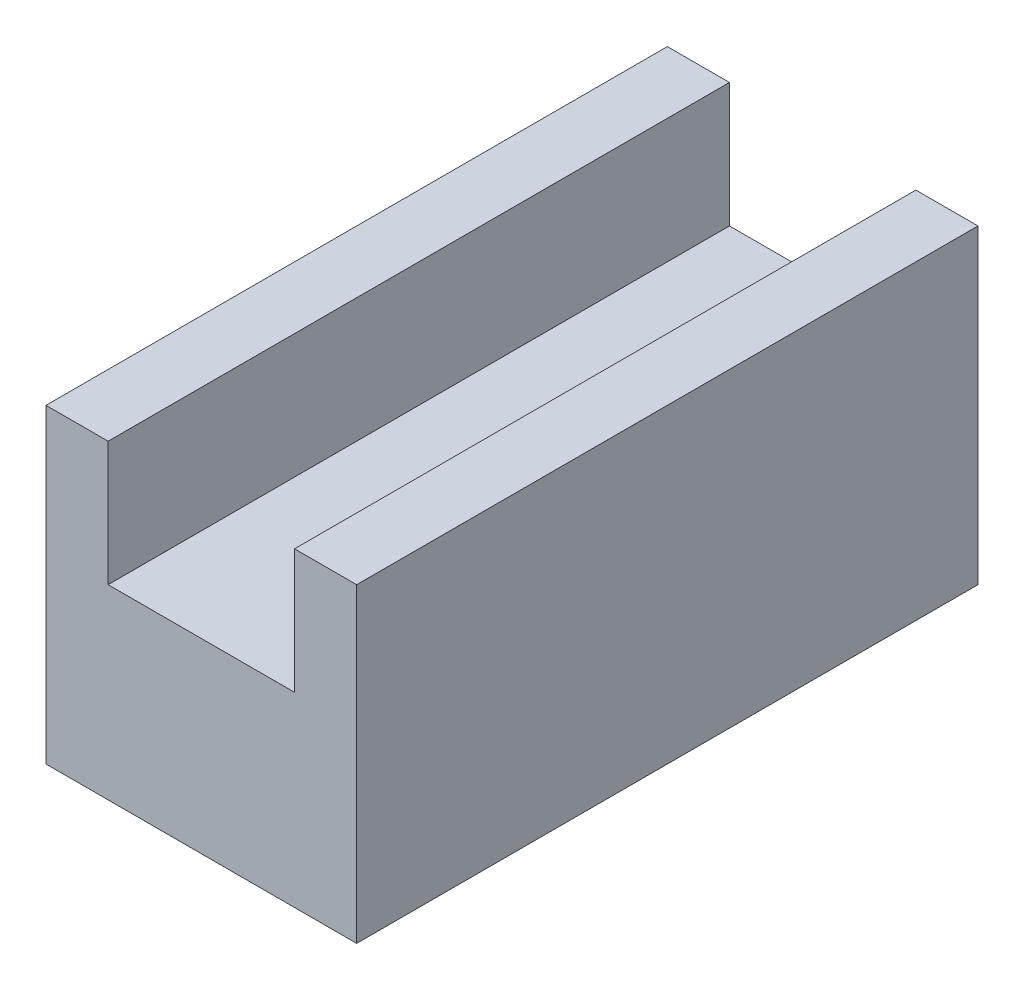
ISO-10303-21;
HEADER;
FILE_DESCRIPTION(('STEP AP214'),'2;1');
FILE_NAME('part.step','',(''),(''),'','','');
FILE_SCHEMA(('AUTOMOTIVE_DESIGN { 1 0 10303 214 1 1 1 1 }'));
ENDSEC;
DATA;
#1=APPLICATION_CONTEXT('core data for automotive mechanical design processes');
#2=APPLICATION_PROTOCOL_DEFINITION('international standard','automotive_design',2000,#1);
#3=PRODUCT_CONTEXT('',#1,'mechanical');
#4=PRODUCT('Part','Part','',(#3));
#5=PRODUCT_RELATED_PRODUCT_CATEGORY('part','',(#4));
#6=PRODUCT_DEFINITION_FORMATION('','',#4);
#7=PRODUCT_DEFINITION_CONTEXT('part definition',#1,'design');
#8=PRODUCT_DEFINITION('design','',#6,#7);
#9=PRODUCT_DEFINITION_SHAPE('','',#8);
#10=(LENGTH_UNIT() NAMED_UNIT(*) SI_UNIT(.MILLI.,.METRE.));
#11=(NAMED_UNIT(*) PLANE_ANGLE_UNIT() SI_UNIT($,.RADIAN.));
#12=(NAMED_UNIT(*) SI_UNIT($,.STERADIAN.) SOLID_ANGLE_UNIT());
#13=UNCERTAINTY_MEASURE_WITH_UNIT(LENGTH_MEASURE(1.E-05),#10,'distance_accuracy_value','');
#14=(GEOMETRIC_REPRESENTATION_CONTEXT(3) GLOBAL_UNCERTAINTY_ASSIGNED_CONTEXT((#13)) GLOBAL_UNIT_ASSIGNED_CONTEXT((#10,
#11,#12)) REPRESENTATION_CONTEXT('',''));
#15=CARTESIAN_POINT('',(0.,0.,0.));
#16=DIRECTION('',(0.,0.,1.));
#17=DIRECTION('',(1.,0.,0.));
#18=AXIS2_PLACEMENT_3D('',#15,#16,#17);
#19=CARTESIAN_POINT('',(0.,5.,10.));
#20=DIRECTION('',(0.,-1.,0.));
#21=DIRECTION('',(0.,0.,-1.));
#22=AXIS2_PLACEMENT_3D('',#19,#20,#21);
#23=PLANE('',#22);
#24=DIRECTION('',(-1.,0.,0.));
#25=VECTOR('',#24,1.);
#26=CARTESIAN_POINT('',(0.,5.,10.));
#27=LINE('',#26,#25);
#28=CARTESIAN_POINT('',(1.,5.,10.));
#29=VERTEX_POINT('',#28);
#30=CARTESIAN_POINT('',(0.,5.,10.));
#31=VERTEX_POINT('',#30);
#32=EDGE_CURVE('E57',#29,#31,#27,.T.);
#33=ORIENTED_EDGE('',*,*,#32,.F.);
#34=DIRECTION('',(0.,0.,1.));
#35=VECTOR('',#34,1.);
#36=CARTESIAN_POINT('',(1.,5.,0.));
#37=LINE('',#36,#35);
#38=CARTESIAN_POINT('',(1.,5.,0.));
#39=VERTEX_POINT('',#38);
#40=EDGE_CURVE('E111',#39,#29,#37,.T.);
#41=ORIENTED_EDGE('',*,*,#40,.F.);
#42=DIRECTION('',(-1.,0.,0.));
#43=VECTOR('',#42,1.);
#44=CARTESIAN_POINT('',(0.,5.,0.));
#45=LINE('',#44,#43);
#46=CARTESIAN_POINT('',(0.,5.,0.));
#47=VERTEX_POINT('',#46);
#48=EDGE_CURVE('E79',#39,#47,#45,.T.);
#49=ORIENTED_EDGE('',*,*,#48,.T.);
#50=DIRECTION('',(0.,0.,-1.));
#51=VECTOR('',#50,1.);
#52=CARTESIAN_POINT('',(0.,5.,10.));
#53=LINE('',#52,#51);
#54=EDGE_CURVE('E146',#31,#47,#53,.T.);
#55=ORIENTED_EDGE('',*,*,#54,.F.);
#56=EDGE_LOOP('',(#33,#41,#49,#55));
#57=FACE_BOUND('',#56,.T.);
#58=ADVANCED_FACE('F33',(#57),#23,.F.);
#59=CARTESIAN_POINT('',(0.,0.,10.));
#60=DIRECTION('',(1.,0.,0.));
#61=DIRECTION('',(0.,0.,-1.));
#62=AXIS2_PLACEMENT_3D('',#59,#60,#61);
#63=PLANE('',#62);
#64=DIRECTION('',(0.,-1.,0.));
#65=VECTOR('',#64,1.);
#66=CARTESIAN_POINT('',(0.,0.,0.));
#67=LINE('',#66,#65);
#68=CARTESIAN_POINT('',(0.,0.,0.));
#69=VERTEX_POINT('',#68);
#70=EDGE_CURVE('E133',#47,#69,#67,.T.);
#71=ORIENTED_EDGE('',*,*,#70,.T.);
#72=DIRECTION('',(0.,0.,-1.));
#73=VECTOR('',#72,1.);
#74=CARTESIAN_POINT('',(0.,0.,10.));
#75=LINE('',#74,#73);
#76=CARTESIAN_POINT('',(0.,0.,10.));
#77=VERTEX_POINT('',#76);
#78=EDGE_CURVE('E11',#77,#69,#75,.T.);
#79=ORIENTED_EDGE('',*,*,#78,.F.);
#80=DIRECTION('',(0.,-1.,0.));
#81=VECTOR('',#80,1.);
#82=CARTESIAN_POINT('',(0.,0.,10.));
#83=LINE('',#82,#81);
#84=EDGE_CURVE('E138',#31,#77,#83,.T.);
#85=ORIENTED_EDGE('',*,*,#84,.F.);
#86=ORIENTED_EDGE('',*,*,#54,.T.);
#87=EDGE_LOOP('',(#71,#79,#85,#86));
#88=FACE_BOUND('',#87,.T.);
#89=ADVANCED_FACE('F35',(#88),#63,.F.);
#90=CARTESIAN_POINT('',(0.,0.,10.));
#91=DIRECTION('',(0.,1.,0.));
#92=DIRECTION('',(0.,0.,1.));
#93=AXIS2_PLACEMENT_3D('',#90,#91,#92);
#94=PLANE('',#93);
#95=DIRECTION('',(1.,0.,0.));
#96=VECTOR('',#95,1.);
#97=CARTESIAN_POINT('',(0.,0.,0.));
#98=LINE('',#97,#96);
#99=CARTESIAN_POINT('',(5.,0.,0.));
#100=VERTEX_POINT('',#99);
#101=EDGE_CURVE('E149',#69,#100,#98,.T.);
#102=ORIENTED_EDGE('',*,*,#101,.T.);
#103=DIRECTION('',(0.,0.,-1.));
#104=VECTOR('',#103,1.);
#105=CARTESIAN_POINT('',(5.,0.,10.));
#106=LINE('',#105,#104);
#107=CARTESIAN_POINT('',(5.,0.,10.));
#108=VERTEX_POINT('',#107);
#109=EDGE_CURVE('E41',#108,#100,#106,.T.);
#110=ORIENTED_EDGE('',*,*,#109,.F.);
#111=DIRECTION('',(1.,0.,0.));
#112=VECTOR('',#111,1.);
#113=CARTESIAN_POINT('',(0.,0.,10.));
#114=LINE('',#113,#112);
#115=EDGE_CURVE('E86',#77,#108,#114,.T.);
#116=ORIENTED_EDGE('',*,*,#115,.F.);
#117=ORIENTED_EDGE('',*,*,#78,.T.);
#118=EDGE_LOOP('',(#102,#110,#116,#117));
#119=FACE_BOUND('',#118,.T.);
#120=ADVANCED_FACE('F175',(#119),#94,.F.);
#121=CARTESIAN_POINT('',(5.,0.,10.));
#122=DIRECTION('',(-1.,0.,0.));
#123=DIRECTION('',(0.,0.,1.));
#124=AXIS2_PLACEMENT_3D('',#121,#122,#123);
#125=PLANE('',#124);
#126=DIRECTION('',(0.,1.,0.));
#127=VECTOR('',#126,1.);
#128=CARTESIAN_POINT('',(5.,0.,0.));
#129=LINE('',#128,#127);
#130=CARTESIAN_POINT('',(5.,5.,0.));
#131=VERTEX_POINT('',#130);
#132=EDGE_CURVE('E151',#100,#131,#129,.T.);
#133=ORIENTED_EDGE('',*,*,#132,.T.);
#134=DIRECTION('',(0.,0.,-1.));
#135=VECTOR('',#134,1.);
#136=CARTESIAN_POINT('',(5.,5.,10.));
#137=LINE('',#136,#135);
#138=CARTESIAN_POINT('',(5.,5.,10.));
#139=VERTEX_POINT('',#138);
#140=EDGE_CURVE('E156',#139,#131,#137,.T.);
#141=ORIENTED_EDGE('',*,*,#140,.F.);
#142=DIRECTION('',(0.,1.,0.));
#143=VECTOR('',#142,1.);
#144=CARTESIAN_POINT('',(5.,0.,10.));
#145=LINE('',#144,#143);
#146=EDGE_CURVE('E142',#108,#139,#145,.T.);
#147=ORIENTED_EDGE('',*,*,#146,.F.);
#148=ORIENTED_EDGE('',*,*,#109,.T.);
#149=EDGE_LOOP('',(#133,#141,#147,#148));
#150=FACE_BOUND('',#149,.T.);
#151=ADVANCED_FACE('F162',(#150),#125,.F.);
#152=CARTESIAN_POINT('',(4.,5.,0.));
#153=VERTEX_POINT('',#152);
#154=EDGE_CURVE('E140',#131,#153,#45,.T.);
#155=ORIENTED_EDGE('',*,*,#154,.T.);
#156=DIRECTION('',(0.,0.,-1.));
#157=VECTOR('',#156,1.);
#158=CARTESIAN_POINT('',(4.,5.,0.));
#159=LINE('',#158,#157);
#160=CARTESIAN_POINT('',(4.,5.,10.));
#161=VERTEX_POINT('',#160);
#162=EDGE_CURVE('E121',#161,#153,#159,.T.);
#163=ORIENTED_EDGE('',*,*,#162,.F.);
#164=EDGE_CURVE('E144',#139,#161,#27,.T.);
#165=ORIENTED_EDGE('',*,*,#164,.F.);
#166=ORIENTED_EDGE('',*,*,#140,.T.);
#167=EDGE_LOOP('',(#155,#163,#165,#166));
#168=FACE_BOUND('',#167,.T.);
#169=ADVANCED_FACE('F170',(#168),#23,.F.);
#170=CARTESIAN_POINT('',(0.,0.,10.));
#171=DIRECTION('',(0.,0.,-1.));
#172=DIRECTION('',(-1.,0.,0.));
#173=AXIS2_PLACEMENT_3D('',#170,#171,#172);
#174=PLANE('',#173);
#175=DIRECTION('',(1.,0.,0.));
#176=VECTOR('',#175,1.);
#177=CARTESIAN_POINT('',(1.,3.,10.));
#178=LINE('',#177,#176);
#179=CARTESIAN_POINT('',(1.,3.,10.));
#180=VERTEX_POINT('',#179);
#181=CARTESIAN_POINT('',(4.,3.,10.));
#182=VERTEX_POINT('',#181);
#183=EDGE_CURVE('E117',#180,#182,#178,.T.);
#184=ORIENTED_EDGE('',*,*,#183,.F.);
#185=DIRECTION('',(0.,1.,0.));
#186=VECTOR('',#185,1.);
#187=CARTESIAN_POINT('',(1.,3.,10.));
#188=LINE('',#187,#186);
#189=EDGE_CURVE('E107',#180,#29,#188,.T.);
#190=ORIENTED_EDGE('',*,*,#189,.T.);
#191=ORIENTED_EDGE('',*,*,#32,.T.);
#192=ORIENTED_EDGE('',*,*,#84,.T.);
#193=ORIENTED_EDGE('',*,*,#115,.T.);
#194=ORIENTED_EDGE('',*,*,#146,.T.);
#195=ORIENTED_EDGE('',*,*,#164,.T.);
#196=DIRECTION('',(0.,1.,0.));
#197=VECTOR('',#196,1.);
#198=CARTESIAN_POINT('',(4.,3.,10.));
#199=LINE('',#198,#197);
#200=EDGE_CURVE('E113',#182,#161,#199,.T.);
#201=ORIENTED_EDGE('',*,*,#200,.F.);
#202=EDGE_LOOP('',(#184,#190,#191,#192,#193,#194,#195,#201));
#203=FACE_BOUND('',#202,.T.);
#204=ADVANCED_FACE('F123',(#203),#174,.F.);
#205=CARTESIAN_POINT('',(0.,0.,0.));
#206=DIRECTION('',(0.,0.,-1.));
#207=DIRECTION('',(-1.,0.,0.));
#208=AXIS2_PLACEMENT_3D('',#205,#206,#207);
#209=PLANE('',#208);
#210=DIRECTION('',(0.,1.,0.));
#211=VECTOR('',#210,1.);
#212=CARTESIAN_POINT('',(1.,3.,0.));
#213=LINE('',#212,#211);
#214=CARTESIAN_POINT('',(1.,3.,0.));
#215=VERTEX_POINT('',#214);
#216=EDGE_CURVE('E131',#215,#39,#213,.T.);
#217=ORIENTED_EDGE('',*,*,#216,.F.);
#218=DIRECTION('',(-1.,0.,0.));
#219=VECTOR('',#218,1.);
#220=CARTESIAN_POINT('',(1.,3.,0.));
#221=LINE('',#220,#219);
#222=CARTESIAN_POINT('',(4.,3.,0.));
#223=VERTEX_POINT('',#222);
#224=EDGE_CURVE('E114',#223,#215,#221,.T.);
#225=ORIENTED_EDGE('',*,*,#224,.F.);
#226=DIRECTION('',(0.,1.,0.));
#227=VECTOR('',#226,1.);
#228=CARTESIAN_POINT('',(4.,3.,0.));
#229=LINE('',#228,#227);
#230=EDGE_CURVE('E134',#223,#153,#229,.T.);
#231=ORIENTED_EDGE('',*,*,#230,.T.);
#232=ORIENTED_EDGE('',*,*,#154,.F.);
#233=ORIENTED_EDGE('',*,*,#132,.F.);
#234=ORIENTED_EDGE('',*,*,#101,.F.);
#235=ORIENTED_EDGE('',*,*,#70,.F.);
#236=ORIENTED_EDGE('',*,*,#48,.F.);
#237=EDGE_LOOP('',(#217,#225,#231,#232,#233,#234,#235,#236));
#238=FACE_BOUND('',#237,.T.);
#239=ADVANCED_FACE('F166',(#238),#209,.T.);
#240=CARTESIAN_POINT('',(1.,3.,0.));
#241=DIRECTION('',(-1.,0.,0.));
#242=DIRECTION('',(0.,0.,1.));
#243=AXIS2_PLACEMENT_3D('',#240,#241,#242);
#244=PLANE('',#243);
#245=ORIENTED_EDGE('',*,*,#40,.T.);
#246=ORIENTED_EDGE('',*,*,#189,.F.);
#247=DIRECTION('',(0.,0.,1.));
#248=VECTOR('',#247,1.);
#249=CARTESIAN_POINT('',(1.,3.,0.));
#250=LINE('',#249,#248);
#251=EDGE_CURVE('E110',#215,#180,#250,.T.);
#252=ORIENTED_EDGE('',*,*,#251,.F.);
#253=ORIENTED_EDGE('',*,*,#216,.T.);
#254=EDGE_LOOP('',(#245,#246,#252,#253));
#255=FACE_BOUND('',#254,.T.);
#256=ADVANCED_FACE('F109',(#255),#244,.F.);
#257=CARTESIAN_POINT('',(4.,3.,0.));
#258=DIRECTION('',(1.,0.,0.));
#259=DIRECTION('',(0.,0.,-1.));
#260=AXIS2_PLACEMENT_3D('',#257,#258,#259);
#261=PLANE('',#260);
#262=ORIENTED_EDGE('',*,*,#162,.T.);
#263=ORIENTED_EDGE('',*,*,#230,.F.);
#264=DIRECTION('',(0.,0.,-1.));
#265=VECTOR('',#264,1.);
#266=CARTESIAN_POINT('',(4.,3.,0.));
#267=LINE('',#266,#265);
#268=EDGE_CURVE('E48',#182,#223,#267,.T.);
#269=ORIENTED_EDGE('',*,*,#268,.F.);
#270=ORIENTED_EDGE('',*,*,#200,.T.);
#271=EDGE_LOOP('',(#262,#263,#269,#270));
#272=FACE_BOUND('',#271,.T.);
#273=ADVANCED_FACE('F198',(#272),#261,.F.);
#274=CARTESIAN_POINT('',(0.,3.,0.));
#275=DIRECTION('',(0.,1.,0.));
#276=DIRECTION('',(0.,0.,1.));
#277=AXIS2_PLACEMENT_3D('',#274,#275,#276);
#278=PLANE('',#277);
#279=ORIENTED_EDGE('',*,*,#251,.T.);
#280=ORIENTED_EDGE('',*,*,#183,.T.);
#281=ORIENTED_EDGE('',*,*,#268,.T.);
#282=ORIENTED_EDGE('',*,*,#224,.T.);
#283=EDGE_LOOP('',(#279,#280,#281,#282));
#284=FACE_BOUND('',#283,.T.);
#285=ADVANCED_FACE('F116',(#284),#278,.T.);
#286=CLOSED_SHELL('',(#58,#89,#120,#151,#169,#204,#239,#256,#273,#285));
#287=MANIFOLD_SOLID_BREP('B2',#286);
#288=ADVANCED_BREP_SHAPE_REPRESENTATION('',(#18,#287),#14);
#289=SHAPE_DEFINITION_REPRESENTATION(#9,#288);
ENDSEC;
END-ISO-10303-21;
